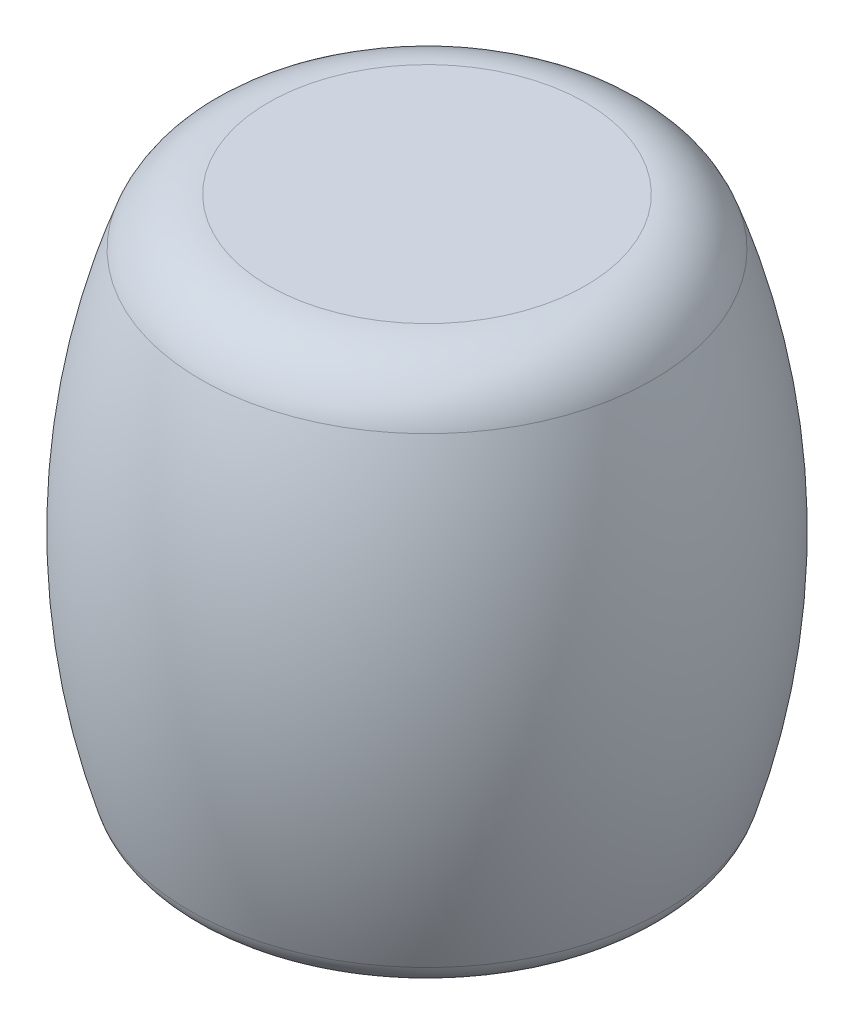
ISO-10303-21;
HEADER;
FILE_DESCRIPTION(('STEP AP214'),'2;1');
FILE_NAME('part.step','',(''),(''),'','','');
FILE_SCHEMA(('AUTOMOTIVE_DESIGN { 1 0 10303 214 1 1 1 1 }'));
ENDSEC;
DATA;
#1=APPLICATION_CONTEXT('core data for automotive mechanical design processes');
#2=APPLICATION_PROTOCOL_DEFINITION('international standard','automotive_design',2000,#1);
#3=PRODUCT_CONTEXT('',#1,'mechanical');
#4=PRODUCT('Part','Part','',(#3));
#5=PRODUCT_RELATED_PRODUCT_CATEGORY('part','',(#4));
#6=PRODUCT_DEFINITION_FORMATION('','',#4);
#7=PRODUCT_DEFINITION_CONTEXT('part definition',#1,'design');
#8=PRODUCT_DEFINITION('design','',#6,#7);
#9=PRODUCT_DEFINITION_SHAPE('','',#8);
#10=(LENGTH_UNIT() NAMED_UNIT(*) SI_UNIT(.MILLI.,.METRE.));
#11=(NAMED_UNIT(*) PLANE_ANGLE_UNIT() SI_UNIT($,.RADIAN.));
#12=(NAMED_UNIT(*) SI_UNIT($,.STERADIAN.) SOLID_ANGLE_UNIT());
#13=UNCERTAINTY_MEASURE_WITH_UNIT(LENGTH_MEASURE(1.E-05),#10,'distance_accuracy_value','');
#14=(GEOMETRIC_REPRESENTATION_CONTEXT(3) GLOBAL_UNCERTAINTY_ASSIGNED_CONTEXT((#13)) GLOBAL_UNIT_ASSIGNED_CONTEXT((#10,
#11,#12)) REPRESENTATION_CONTEXT('',''));
#15=CARTESIAN_POINT('',(0.,0.,0.));
#16=DIRECTION('',(0.,0.,1.));
#17=DIRECTION('',(1.,0.,0.));
#18=AXIS2_PLACEMENT_3D('',#15,#16,#17);
#19=CARTESIAN_POINT('',(-90.,190.,0.));
#20=DIRECTION('',(0.,-1.,0.));
#21=DIRECTION('',(0.,0.,-1.));
#22=AXIS2_PLACEMENT_3D('',#19,#20,#21);
#23=TOROIDAL_SURFACE('',#22,66.1906152999791,29.9999999999999);
#24=CARTESIAN_POINT('',(-90.,200.169084884453,0.));
#25=DIRECTION('',(0.,-1.,0.));
#26=DIRECTION('',(0.,0.,-1.));
#27=AXIS2_PLACEMENT_3D('',#24,#25,#26);
#28=CIRCLE('',#27,94.4145362290914);
#29=CARTESIAN_POINT('',(-90.,200.169084884453,-94.4145362290914));
#30=VERTEX_POINT('',#29);
#31=EDGE_CURVE('E75',#30,#30,#28,.T.);
#32=ORIENTED_EDGE('',*,*,#31,.F.);
#33=EDGE_LOOP('',(#32));
#34=FACE_BOUND('',#33,.T.);
#35=CARTESIAN_POINT('',(-90.,220.,0.));
#36=DIRECTION('',(0.,-1.,0.));
#37=DIRECTION('',(0.,0.,-1.));
#38=AXIS2_PLACEMENT_3D('',#35,#36,#37);
#39=CIRCLE('',#38,66.1906152999791);
#40=CARTESIAN_POINT('',(-90.,220.,-66.1906152999791));
#41=VERTEX_POINT('',#40);
#42=EDGE_CURVE('E10',#41,#41,#39,.T.);
#43=ORIENTED_EDGE('',*,*,#42,.T.);
#44=EDGE_LOOP('',(#43));
#45=FACE_BOUND('',#44,.T.);
#46=ADVANCED_FACE('F44',(#34,#45),#23,.T.);
#47=CARTESIAN_POINT('',(0.,220.,0.));
#48=DIRECTION('',(0.,1.,0.));
#49=DIRECTION('',(0.,0.,1.));
#50=AXIS2_PLACEMENT_3D('',#47,#48,#49);
#51=PLANE('',#50);
#52=ORIENTED_EDGE('',*,*,#42,.F.);
#53=EDGE_LOOP('',(#52));
#54=FACE_BOUND('',#53,.T.);
#55=ADVANCED_FACE('F95',(#54),#51,.T.);
#56=CARTESIAN_POINT('',(0.,0.,0.));
#57=DIRECTION('',(0.,1.,0.));
#58=DIRECTION('',(0.,0.,1.));
#59=AXIS2_PLACEMENT_3D('',#56,#57,#58);
#60=PLANE('',#59);
#61=CARTESIAN_POINT('',(-90.,0.,0.));
#62=DIRECTION('',(0.,-1.,0.));
#63=DIRECTION('',(0.,0.,-1.));
#64=AXIS2_PLACEMENT_3D('',#61,#62,#63);
#65=CIRCLE('',#64,81.);
#66=CARTESIAN_POINT('',(-90.,0.,-81.));
#67=VERTEX_POINT('',#66);
#68=EDGE_CURVE('E83',#67,#67,#65,.T.);
#69=ORIENTED_EDGE('',*,*,#68,.F.);
#70=EDGE_LOOP('',(#69));
#71=FACE_BOUND('',#70,.T.);
#72=CARTESIAN_POINT('',(-90.,0.,0.));
#73=DIRECTION('',(0.,-1.,0.));
#74=DIRECTION('',(0.,0.,-1.));
#75=AXIS2_PLACEMENT_3D('',#72,#73,#74);
#76=CIRCLE('',#75,86.2743090182219);
#77=CARTESIAN_POINT('',(-90.,0.,-86.2743090182219));
#78=VERTEX_POINT('',#77);
#79=EDGE_CURVE('E67',#78,#78,#76,.T.);
#80=ORIENTED_EDGE('',*,*,#79,.T.);
#81=EDGE_LOOP('',(#80));
#82=FACE_BOUND('',#81,.T.);
#83=ADVANCED_FACE('F91',(#71,#82),#60,.F.);
#84=CARTESIAN_POINT('',(-90.,14.911629650755,0.));
#85=DIRECTION('',(0.,-1.,0.));
#86=DIRECTION('',(0.,0.,-1.));
#87=AXIS2_PLACEMENT_3D('',#84,#85,#86);
#88=TOROIDAL_SURFACE('',#87,84.6484857932909,15.);
#89=ORIENTED_EDGE('',*,*,#79,.F.);
#90=EDGE_LOOP('',(#89));
#91=FACE_BOUND('',#90,.T.);
#92=CARTESIAN_POINT('',(-90.,10.5133872092198,0.));
#93=DIRECTION('',(0.,-1.,0.));
#94=DIRECTION('',(0.,0.,-1.));
#95=AXIS2_PLACEMENT_3D('',#92,#93,#94);
#96=CIRCLE('',#95,98.9891783646236);
#97=CARTESIAN_POINT('',(-90.,10.5133872092198,-98.9891783646236));
#98=VERTEX_POINT('',#97);
#99=EDGE_CURVE('E71',#98,#98,#96,.T.);
#100=ORIENTED_EDGE('',*,*,#99,.T.);
#101=EDGE_LOOP('',(#100));
#102=FACE_BOUND('',#101,.T.);
#103=ADVANCED_FACE('F94',(#91,#102),#88,.T.);
#104=CARTESIAN_POINT('',(-90.,98.4782360399215,0.));
#105=DIRECTION('',(0.,-1.,0.));
#106=DIRECTION('',(0.,0.,-1.));
#107=AXIS2_PLACEMENT_3D('',#104,#105,#106);
#108=DEGENERATE_TOROIDAL_SURFACE('',#107,187.824673062032,300.,.F.);
#109=ORIENTED_EDGE('',*,*,#31,.T.);
#110=EDGE_LOOP('',(#109));
#111=FACE_BOUND('',#110,.T.);
#112=ORIENTED_EDGE('',*,*,#99,.F.);
#113=EDGE_LOOP('',(#112));
#114=FACE_BOUND('',#113,.T.);
#115=ADVANCED_FACE('F101',(#111,#114),#108,.F.);
#116=CARTESIAN_POINT('',(-90.,20.,0.));
#117=DIRECTION('',(0.,-1.,0.));
#118=DIRECTION('',(0.,0.,-1.));
#119=AXIS2_PLACEMENT_3D('',#116,#117,#118);
#120=CYLINDRICAL_SURFACE('',#119,81.);
#121=ORIENTED_EDGE('',*,*,#68,.T.);
#122=EDGE_LOOP('',(#121));
#123=FACE_BOUND('',#122,.T.);
#124=CARTESIAN_POINT('',(-90.,14.5672839584296,0.));
#125=DIRECTION('',(0.,1.,0.));
#126=DIRECTION('',(0.,0.,1.));
#127=AXIS2_PLACEMENT_3D('',#124,#125,#126);
#128=CIRCLE('',#127,81.);
#129=CARTESIAN_POINT('',(-90.,14.5672839584296,81.));
#130=VERTEX_POINT('',#129);
#131=EDGE_CURVE('E79',#130,#130,#128,.F.);
#132=ORIENTED_EDGE('',*,*,#131,.F.);
#133=EDGE_LOOP('',(#132));
#134=FACE_BOUND('',#133,.T.);
#135=ADVANCED_FACE('F88',(#123,#134),#120,.F.);
#136=CARTESIAN_POINT('',(0.,205.,0.));
#137=DIRECTION('',(0.,1.,0.));
#138=DIRECTION('',(0.,0.,1.));
#139=AXIS2_PLACEMENT_3D('',#136,#137,#138);
#140=PLANE('',#139);
#141=CARTESIAN_POINT('',(-90.,205.,0.));
#142=DIRECTION('',(0.,-1.,0.));
#143=DIRECTION('',(0.,0.,-1.));
#144=AXIS2_PLACEMENT_3D('',#141,#142,#143);
#145=CIRCLE('',#144,66.1906152999791);
#146=CARTESIAN_POINT('',(-90.,205.,-66.1906152999791));
#147=VERTEX_POINT('',#146);
#148=EDGE_CURVE('E51',#147,#147,#145,.T.);
#149=ORIENTED_EDGE('',*,*,#148,.T.);
#150=EDGE_LOOP('',(#149));
#151=FACE_BOUND('',#150,.T.);
#152=ADVANCED_FACE('F111',(#151),#140,.F.);
#153=CARTESIAN_POINT('',(-90.,190.,0.));
#154=DIRECTION('',(0.,-1.,0.));
#155=DIRECTION('',(0.,0.,-1.));
#156=AXIS2_PLACEMENT_3D('',#153,#154,#155);
#157=TOROIDAL_SURFACE('',#156,66.1906152999791,15.);
#158=CARTESIAN_POINT('',(-90.,195.084542442227,0.));
#159=DIRECTION('',(0.,-1.,0.));
#160=DIRECTION('',(0.,0.,-1.));
#161=AXIS2_PLACEMENT_3D('',#158,#159,#160);
#162=CIRCLE('',#161,80.3025757645352);
#163=CARTESIAN_POINT('',(-90.,195.084542442227,-80.3025757645352));
#164=VERTEX_POINT('',#163);
#165=EDGE_CURVE('E56',#164,#164,#162,.T.);
#166=ORIENTED_EDGE('',*,*,#165,.T.);
#167=EDGE_LOOP('',(#166));
#168=FACE_BOUND('',#167,.T.);
#169=ORIENTED_EDGE('',*,*,#148,.F.);
#170=EDGE_LOOP('',(#169));
#171=FACE_BOUND('',#170,.T.);
#172=ADVANCED_FACE('F125',(#168,#171),#157,.F.);
#173=CARTESIAN_POINT('',(-90.,98.4782360399215,0.));
#174=DIRECTION('',(0.,-1.,0.));
#175=DIRECTION('',(0.,0.,-1.));
#176=AXIS2_PLACEMENT_3D('',#173,#174,#175);
#177=DEGENERATE_TOROIDAL_SURFACE('',#176,187.824673062032,285.,.F.);
#178=ORIENTED_EDGE('',*,*,#165,.F.);
#179=EDGE_LOOP('',(#178));
#180=FACE_BOUND('',#179,.T.);
#181=CARTESIAN_POINT('',(-90.,14.911629650755,0.));
#182=DIRECTION('',(0.,-1.,0.));
#183=DIRECTION('',(0.,0.,-1.));
#184=AXIS2_PLACEMENT_3D('',#181,#182,#183);
#185=CIRCLE('',#184,84.6484857932909);
#186=CARTESIAN_POINT('',(-90.,14.911629650755,-84.6484857932909));
#187=VERTEX_POINT('',#186);
#188=EDGE_CURVE('E61',#187,#187,#185,.T.);
#189=ORIENTED_EDGE('',*,*,#188,.T.);
#190=EDGE_LOOP('',(#189));
#191=FACE_BOUND('',#190,.T.);
#192=ADVANCED_FACE('F128',(#180,#191),#177,.T.);
#193=CARTESIAN_POINT('',(-90.,14.2370702095727,0.));
#194=DIRECTION('',(0.,1.,0.));
#195=DIRECTION('',(0.,0.,1.));
#196=AXIS2_PLACEMENT_3D('',#193,#194,#195);
#197=CONICAL_SURFACE('',#196,77.5012480239906,1.47669463562331);
#198=ORIENTED_EDGE('',*,*,#131,.T.);
#199=EDGE_LOOP('',(#198));
#200=FACE_BOUND('',#199,.T.);
#201=ORIENTED_EDGE('',*,*,#188,.F.);
#202=EDGE_LOOP('',(#201));
#203=FACE_BOUND('',#202,.T.);
#204=ADVANCED_FACE('F132',(#200,#203),#197,.F.);
#205=CLOSED_SHELL('',(#46,#55,#83,#103,#115,#135,#152,#172,#192,#204));
#206=MANIFOLD_SOLID_BREP('B2',#205);
#207=ADVANCED_BREP_SHAPE_REPRESENTATION('',(#18,#206),#14);
#208=SHAPE_DEFINITION_REPRESENTATION(#9,#207);
ENDSEC;
END-ISO-10303-21;
